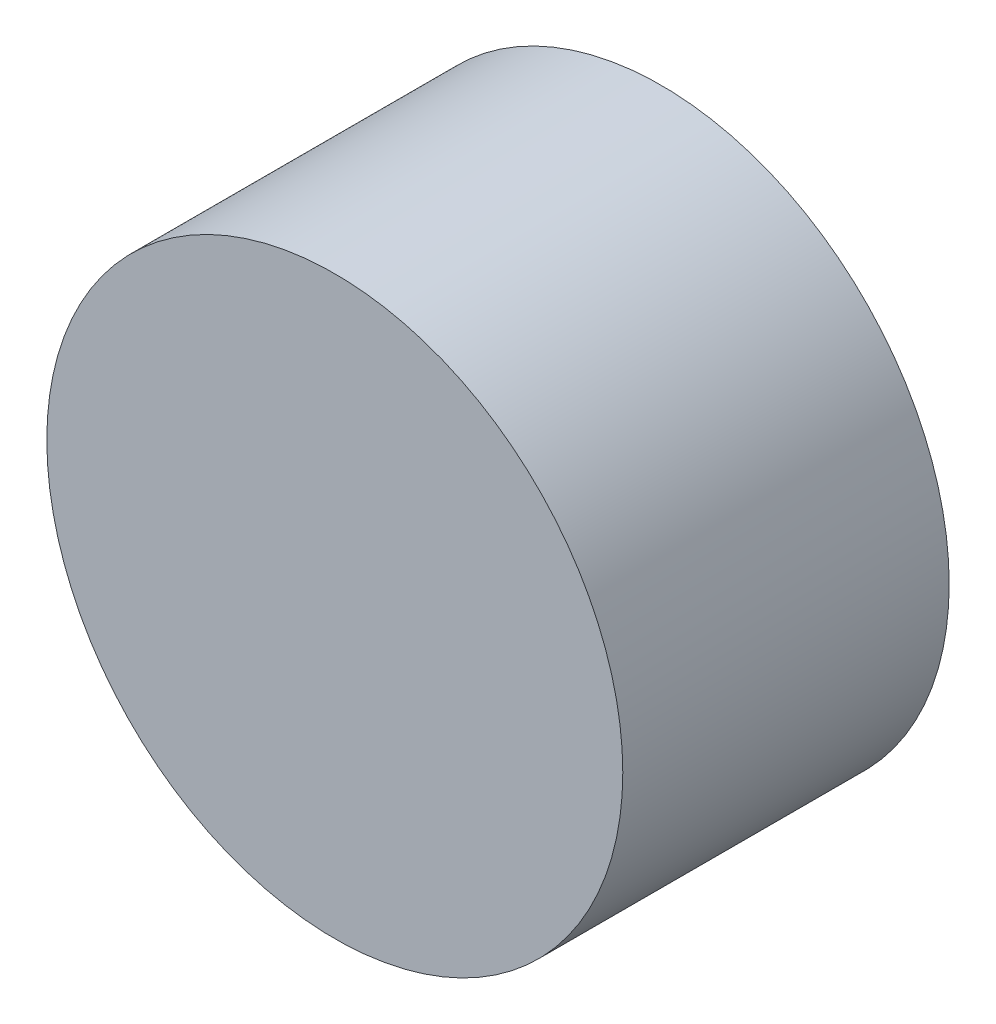
ISO-10303-21;
HEADER;
FILE_DESCRIPTION(('STEP AP214'),'2;1');
FILE_NAME('part.step','',(''),(''),'','','');
FILE_SCHEMA(('AUTOMOTIVE_DESIGN { 1 0 10303 214 1 1 1 1 }'));
ENDSEC;
DATA;
#1=APPLICATION_CONTEXT('core data for automotive mechanical design processes');
#2=APPLICATION_PROTOCOL_DEFINITION('international standard','automotive_design',2000,#1);
#3=PRODUCT_CONTEXT('',#1,'mechanical');
#4=PRODUCT('Part','Part','',(#3));
#5=PRODUCT_RELATED_PRODUCT_CATEGORY('part','',(#4));
#6=PRODUCT_DEFINITION_FORMATION('','',#4);
#7=PRODUCT_DEFINITION_CONTEXT('part definition',#1,'design');
#8=PRODUCT_DEFINITION('design','',#6,#7);
#9=PRODUCT_DEFINITION_SHAPE('','',#8);
#10=(LENGTH_UNIT() NAMED_UNIT(*) SI_UNIT(.MILLI.,.METRE.));
#11=(NAMED_UNIT(*) PLANE_ANGLE_UNIT() SI_UNIT($,.RADIAN.));
#12=(NAMED_UNIT(*) SI_UNIT($,.STERADIAN.) SOLID_ANGLE_UNIT());
#13=UNCERTAINTY_MEASURE_WITH_UNIT(LENGTH_MEASURE(1.E-05),#10,'distance_accuracy_value','');
#14=(GEOMETRIC_REPRESENTATION_CONTEXT(3) GLOBAL_UNCERTAINTY_ASSIGNED_CONTEXT((#13)) GLOBAL_UNIT_ASSIGNED_CONTEXT((#10,
#11,#12)) REPRESENTATION_CONTEXT('',''));
#15=CARTESIAN_POINT('',(0.,0.,0.));
#16=DIRECTION('',(0.,0.,1.));
#17=DIRECTION('',(1.,0.,0.));
#18=AXIS2_PLACEMENT_3D('',#15,#16,#17);
#19=CARTESIAN_POINT('',(0.,0.,3.4));
#20=DIRECTION('',(0.,0.,-1.));
#21=DIRECTION('',(-1.,0.,0.));
#22=AXIS2_PLACEMENT_3D('',#19,#20,#21);
#23=CYLINDRICAL_SURFACE('',#22,3.);
#24=CARTESIAN_POINT('',(0.,0.,3.4));
#25=DIRECTION('',(0.,0.,1.));
#26=DIRECTION('',(1.,0.,0.));
#27=AXIS2_PLACEMENT_3D('',#24,#25,#26);
#28=CIRCLE('',#27,3.);
#29=CARTESIAN_POINT('',(3.,0.,3.4));
#30=VERTEX_POINT('',#29);
#31=EDGE_CURVE('E10',#30,#30,#28,.T.);
#32=ORIENTED_EDGE('',*,*,#31,.F.);
#33=EDGE_LOOP('',(#32));
#34=FACE_BOUND('',#33,.T.);
#35=CARTESIAN_POINT('',(0.,0.,0.));
#36=DIRECTION('',(0.,0.,1.));
#37=DIRECTION('',(1.,0.,0.));
#38=AXIS2_PLACEMENT_3D('',#35,#36,#37);
#39=CIRCLE('',#38,3.);
#40=CARTESIAN_POINT('',(3.,0.,0.));
#41=VERTEX_POINT('',#40);
#42=EDGE_CURVE('E35',#41,#41,#39,.T.);
#43=ORIENTED_EDGE('',*,*,#42,.T.);
#44=EDGE_LOOP('',(#43));
#45=FACE_BOUND('',#44,.T.);
#46=ADVANCED_FACE('F32',(#34,#45),#23,.T.);
#47=CARTESIAN_POINT('',(0.,0.,3.4));
#48=DIRECTION('',(0.,0.,1.));
#49=DIRECTION('',(1.,0.,0.));
#50=AXIS2_PLACEMENT_3D('',#47,#48,#49);
#51=PLANE('',#50);
#52=ORIENTED_EDGE('',*,*,#31,.T.);
#53=EDGE_LOOP('',(#52));
#54=FACE_BOUND('',#53,.T.);
#55=ADVANCED_FACE('F47',(#54),#51,.T.);
#56=CARTESIAN_POINT('',(0.,0.,0.));
#57=DIRECTION('',(0.,0.,1.));
#58=DIRECTION('',(1.,0.,0.));
#59=AXIS2_PLACEMENT_3D('',#56,#57,#58);
#60=PLANE('',#59);
#61=ORIENTED_EDGE('',*,*,#42,.F.);
#62=EDGE_LOOP('',(#61));
#63=FACE_BOUND('',#62,.T.);
#64=ADVANCED_FACE('F45',(#63),#60,.F.);
#65=CLOSED_SHELL('',(#46,#55,#64));
#66=MANIFOLD_SOLID_BREP('B2',#65);
#67=ADVANCED_BREP_SHAPE_REPRESENTATION('',(#18,#66),#14);
#68=SHAPE_DEFINITION_REPRESENTATION(#9,#67);
ENDSEC;
END-ISO-10303-21;
